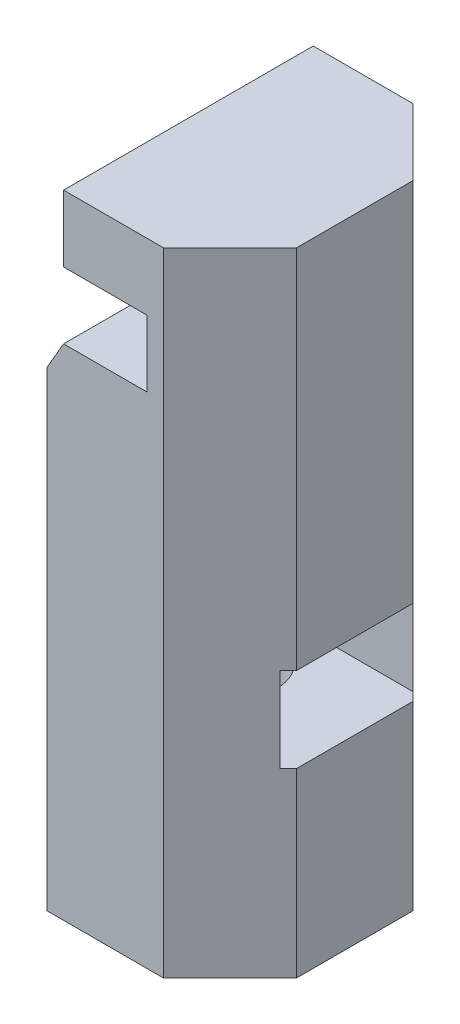
ISO-10303-21;
HEADER;
FILE_DESCRIPTION(('STEP AP214'),'2;1');
FILE_NAME('part.step','',(''),(''),'','','');
FILE_SCHEMA(('AUTOMOTIVE_DESIGN { 1 0 10303 214 1 1 1 1 }'));
ENDSEC;
DATA;
#1=APPLICATION_CONTEXT('core data for automotive mechanical design processes');
#2=APPLICATION_PROTOCOL_DEFINITION('international standard','automotive_design',2000,#1);
#3=PRODUCT_CONTEXT('',#1,'mechanical');
#4=PRODUCT('Part','Part','',(#3));
#5=PRODUCT_RELATED_PRODUCT_CATEGORY('part','',(#4));
#6=PRODUCT_DEFINITION_FORMATION('','',#4);
#7=PRODUCT_DEFINITION_CONTEXT('part definition',#1,'design');
#8=PRODUCT_DEFINITION('design','',#6,#7);
#9=PRODUCT_DEFINITION_SHAPE('','',#8);
#10=(LENGTH_UNIT() NAMED_UNIT(*) SI_UNIT(.MILLI.,.METRE.));
#11=(NAMED_UNIT(*) PLANE_ANGLE_UNIT() SI_UNIT($,.RADIAN.));
#12=(NAMED_UNIT(*) SI_UNIT($,.STERADIAN.) SOLID_ANGLE_UNIT());
#13=UNCERTAINTY_MEASURE_WITH_UNIT(LENGTH_MEASURE(1.E-05),#10,'distance_accuracy_value','');
#14=(GEOMETRIC_REPRESENTATION_CONTEXT(3) GLOBAL_UNCERTAINTY_ASSIGNED_CONTEXT((#13)) GLOBAL_UNIT_ASSIGNED_CONTEXT((#10,
#11,#12)) REPRESENTATION_CONTEXT('',''));
#15=CARTESIAN_POINT('',(0.,0.,0.));
#16=DIRECTION('',(0.,0.,1.));
#17=DIRECTION('',(1.,0.,0.));
#18=AXIS2_PLACEMENT_3D('',#15,#16,#17);
#19=CARTESIAN_POINT('',(3.99999999999999,8.,7.5));
#20=DIRECTION('',(-1.,0.,0.));
#21=DIRECTION('',(0.,-1.,0.));
#22=AXIS2_PLACEMENT_3D('',#19,#20,#21);
#23=PLANE('',#22);
#24=DIRECTION('',(0.,0.,-1.));
#25=VECTOR('',#24,1.);
#26=CARTESIAN_POINT('',(4.,-30.,7.5));
#27=LINE('',#26,#25);
#28=CARTESIAN_POINT('',(4.,-30.,3.49999999999999));
#29=VERTEX_POINT('',#28);
#30=CARTESIAN_POINT('',(4.,-30.,-3.49999999999999));
#31=VERTEX_POINT('',#30);
#32=EDGE_CURVE('E289',#29,#31,#27,.T.);
#33=ORIENTED_EDGE('',*,*,#32,.T.);
#34=DIRECTION('',(0.,1.,0.));
#35=VECTOR('',#34,1.);
#36=CARTESIAN_POINT('',(3.99999999999999,8.,-3.5));
#37=LINE('',#36,#35);
#38=CARTESIAN_POINT('',(4.,-19.1,-3.5));
#39=VERTEX_POINT('',#38);
#40=EDGE_CURVE('E279',#31,#39,#37,.T.);
#41=ORIENTED_EDGE('',*,*,#40,.T.);
#42=DIRECTION('',(0.,0.,-1.));
#43=VECTOR('',#42,1.);
#44=CARTESIAN_POINT('',(4.,-19.1,4.));
#45=LINE('',#44,#43);
#46=CARTESIAN_POINT('',(4.,-19.1,3.49999999999999));
#47=VERTEX_POINT('',#46);
#48=EDGE_CURVE('E286',#47,#39,#45,.T.);
#49=ORIENTED_EDGE('',*,*,#48,.F.);
#50=DIRECTION('',(0.,-1.,0.));
#51=VECTOR('',#50,1.);
#52=CARTESIAN_POINT('',(3.99999999999999,8.,3.49999999999999));
#53=LINE('',#52,#51);
#54=EDGE_CURVE('E274',#47,#29,#53,.T.);
#55=ORIENTED_EDGE('',*,*,#54,.T.);
#56=EDGE_LOOP('',(#33,#41,#49,#55));
#57=FACE_BOUND('',#56,.T.);
#58=ADVANCED_FACE('F33',(#57),#23,.F.);
#59=CARTESIAN_POINT('',(-11.,-30.,7.5));
#60=DIRECTION('',(1.,0.,0.));
#61=DIRECTION('',(0.,1.,0.));
#62=AXIS2_PLACEMENT_3D('',#59,#60,#61);
#63=PLANE('',#62);
#64=DIRECTION('',(0.,0.,-1.));
#65=VECTOR('',#64,1.);
#66=CARTESIAN_POINT('',(-11.,-30.,7.5));
#67=LINE('',#66,#65);
#68=CARTESIAN_POINT('',(-11.,-30.,3.49999999999999));
#69=VERTEX_POINT('',#68);
#70=CARTESIAN_POINT('',(-11.,-30.,-3.49999999999999));
#71=VERTEX_POINT('',#70);
#72=EDGE_CURVE('E357',#69,#71,#67,.T.);
#73=ORIENTED_EDGE('',*,*,#72,.F.);
#74=DIRECTION('',(0.,1.,0.));
#75=VECTOR('',#74,1.);
#76=CARTESIAN_POINT('',(-11.,-30.,3.49999999999999));
#77=LINE('',#76,#75);
#78=CARTESIAN_POINT('',(-11.,-19.1,3.49999999999999));
#79=VERTEX_POINT('',#78);
#80=EDGE_CURVE('E240',#69,#79,#77,.T.);
#81=ORIENTED_EDGE('',*,*,#80,.T.);
#82=DIRECTION('',(0.,0.,1.));
#83=VECTOR('',#82,1.);
#84=CARTESIAN_POINT('',(-11.,-19.1,4.));
#85=LINE('',#84,#83);
#86=CARTESIAN_POINT('',(-11.,-19.1,-3.5));
#87=VERTEX_POINT('',#86);
#88=EDGE_CURVE('E322',#87,#79,#85,.T.);
#89=ORIENTED_EDGE('',*,*,#88,.F.);
#90=DIRECTION('',(0.,-1.,0.));
#91=VECTOR('',#90,1.);
#92=CARTESIAN_POINT('',(-11.,-30.,-3.5));
#93=LINE('',#92,#91);
#94=EDGE_CURVE('E233',#87,#71,#93,.T.);
#95=ORIENTED_EDGE('',*,*,#94,.T.);
#96=EDGE_LOOP('',(#73,#81,#89,#95));
#97=FACE_BOUND('',#96,.T.);
#98=ADVANCED_FACE('F405',(#97),#63,.F.);
#99=CARTESIAN_POINT('',(-6.,4.,7.5));
#100=DIRECTION('',(1.,0.,0.));
#101=DIRECTION('',(0.,1.,0.));
#102=AXIS2_PLACEMENT_3D('',#99,#100,#101);
#103=PLANE('',#102);
#104=DIRECTION('',(0.,-1.,0.));
#105=VECTOR('',#104,1.);
#106=CARTESIAN_POINT('',(-6.,4.,-7.5));
#107=LINE('',#106,#105);
#108=CARTESIAN_POINT('',(-6.00000000000001,8.,-7.5));
#109=VERTEX_POINT('',#108);
#110=CARTESIAN_POINT('',(-6.,4.,-7.5));
#111=VERTEX_POINT('',#110);
#112=EDGE_CURVE('E200',#109,#111,#107,.T.);
#113=ORIENTED_EDGE('',*,*,#112,.T.);
#114=DIRECTION('',(0.,0.,-1.));
#115=VECTOR('',#114,1.);
#116=CARTESIAN_POINT('',(-6.,4.,7.5));
#117=LINE('',#116,#115);
#118=CARTESIAN_POINT('',(-6.,4.,7.5));
#119=VERTEX_POINT('',#118);
#120=EDGE_CURVE('E179',#119,#111,#117,.T.);
#121=ORIENTED_EDGE('',*,*,#120,.F.);
#122=DIRECTION('',(0.,-1.,0.));
#123=VECTOR('',#122,1.);
#124=CARTESIAN_POINT('',(-6.,4.,7.5));
#125=LINE('',#124,#123);
#126=CARTESIAN_POINT('',(-6.00000000000001,8.,7.5));
#127=VERTEX_POINT('',#126);
#128=EDGE_CURVE('E186',#127,#119,#125,.T.);
#129=ORIENTED_EDGE('',*,*,#128,.F.);
#130=DIRECTION('',(0.,0.,-1.));
#131=VECTOR('',#130,1.);
#132=CARTESIAN_POINT('',(-6.00000000000001,8.,7.5));
#133=LINE('',#132,#131);
#134=EDGE_CURVE('E340',#127,#109,#133,.T.);
#135=ORIENTED_EDGE('',*,*,#134,.T.);
#136=EDGE_LOOP('',(#113,#121,#129,#135));
#137=FACE_BOUND('',#136,.T.);
#138=ADVANCED_FACE('F198',(#137),#103,.F.);
#139=CARTESIAN_POINT('',(-1.,4.,7.5));
#140=DIRECTION('',(0.,1.,0.));
#141=DIRECTION('',(-1.,0.,0.));
#142=AXIS2_PLACEMENT_3D('',#139,#140,#141);
#143=PLANE('',#142);
#144=DIRECTION('',(1.,0.,0.));
#145=VECTOR('',#144,1.);
#146=CARTESIAN_POINT('',(-1.,4.,-7.5));
#147=LINE('',#146,#145);
#148=CARTESIAN_POINT('',(-1.,4.,-7.5));
#149=VERTEX_POINT('',#148);
#150=EDGE_CURVE('E342',#111,#149,#147,.T.);
#151=ORIENTED_EDGE('',*,*,#150,.T.);
#152=DIRECTION('',(0.,0.,-1.));
#153=VECTOR('',#152,1.);
#154=CARTESIAN_POINT('',(-1.,4.,7.5));
#155=LINE('',#154,#153);
#156=CARTESIAN_POINT('',(-1.,4.,7.5));
#157=VERTEX_POINT('',#156);
#158=EDGE_CURVE('E182',#157,#149,#155,.T.);
#159=ORIENTED_EDGE('',*,*,#158,.F.);
#160=DIRECTION('',(1.,0.,0.));
#161=VECTOR('',#160,1.);
#162=CARTESIAN_POINT('',(-1.,4.,7.5));
#163=LINE('',#162,#161);
#164=EDGE_CURVE('E175',#119,#157,#163,.T.);
#165=ORIENTED_EDGE('',*,*,#164,.F.);
#166=ORIENTED_EDGE('',*,*,#120,.T.);
#167=EDGE_LOOP('',(#151,#159,#165,#166));
#168=FACE_BOUND('',#167,.T.);
#169=ADVANCED_FACE('F177',(#168),#143,.F.);
#170=CARTESIAN_POINT('',(-1.,0.,7.5));
#171=DIRECTION('',(1.,0.,0.));
#172=DIRECTION('',(0.,1.,0.));
#173=AXIS2_PLACEMENT_3D('',#170,#171,#172);
#174=PLANE('',#173);
#175=DIRECTION('',(0.,-1.,0.));
#176=VECTOR('',#175,1.);
#177=CARTESIAN_POINT('',(-1.,0.,-7.5));
#178=LINE('',#177,#176);
#179=CARTESIAN_POINT('',(-1.,0.,-7.5));
#180=VERTEX_POINT('',#179);
#181=EDGE_CURVE('E344',#149,#180,#178,.T.);
#182=ORIENTED_EDGE('',*,*,#181,.T.);
#183=DIRECTION('',(0.,0.,-1.));
#184=VECTOR('',#183,1.);
#185=CARTESIAN_POINT('',(-1.,0.,7.5));
#186=LINE('',#185,#184);
#187=CARTESIAN_POINT('',(-1.,0.,7.5));
#188=VERTEX_POINT('',#187);
#189=EDGE_CURVE('E206',#188,#180,#186,.T.);
#190=ORIENTED_EDGE('',*,*,#189,.F.);
#191=DIRECTION('',(0.,-1.,0.));
#192=VECTOR('',#191,1.);
#193=CARTESIAN_POINT('',(-1.,0.,7.5));
#194=LINE('',#193,#192);
#195=EDGE_CURVE('E185',#157,#188,#194,.T.);
#196=ORIENTED_EDGE('',*,*,#195,.F.);
#197=ORIENTED_EDGE('',*,*,#158,.T.);
#198=EDGE_LOOP('',(#182,#190,#196,#197));
#199=FACE_BOUND('',#198,.T.);
#200=ADVANCED_FACE('F419',(#199),#174,.F.);
#201=CARTESIAN_POINT('',(-11.,0.,7.5));
#202=DIRECTION('',(0.,-1.,0.));
#203=DIRECTION('',(1.,0.,0.));
#204=AXIS2_PLACEMENT_3D('',#201,#202,#203);
#205=PLANE('',#204);
#206=DIRECTION('',(-1.,0.,0.));
#207=VECTOR('',#206,1.);
#208=CARTESIAN_POINT('',(-11.,0.,-7.5));
#209=LINE('',#208,#207);
#210=CARTESIAN_POINT('',(-5.99999999999999,0.,-7.5));
#211=VERTEX_POINT('',#210);
#212=EDGE_CURVE('E346',#180,#211,#209,.T.);
#213=ORIENTED_EDGE('',*,*,#212,.T.);
#214=DIRECTION('',(0.,0.,1.));
#215=VECTOR('',#214,1.);
#216=CARTESIAN_POINT('',(-5.99999999999999,0.,7.5));
#217=LINE('',#216,#215);
#218=CARTESIAN_POINT('',(-5.99999999999999,0.,7.5));
#219=VERTEX_POINT('',#218);
#220=EDGE_CURVE('E216',#211,#219,#217,.T.);
#221=ORIENTED_EDGE('',*,*,#220,.T.);
#222=DIRECTION('',(-1.,0.,0.));
#223=VECTOR('',#222,1.);
#224=CARTESIAN_POINT('',(-11.,0.,7.5));
#225=LINE('',#224,#223);
#226=EDGE_CURVE('E333',#188,#219,#225,.T.);
#227=ORIENTED_EDGE('',*,*,#226,.F.);
#228=ORIENTED_EDGE('',*,*,#189,.T.);
#229=EDGE_LOOP('',(#213,#221,#227,#228));
#230=FACE_BOUND('',#229,.T.);
#231=ADVANCED_FACE('F364',(#230),#205,.F.);
#232=DIRECTION('',(0.,0.,-1.));
#233=VECTOR('',#232,1.);
#234=CARTESIAN_POINT('',(-11.,-14.,4.));
#235=LINE('',#234,#233);
#236=CARTESIAN_POINT('',(-11.,-14.,3.49999999999999));
#237=VERTEX_POINT('',#236);
#238=CARTESIAN_POINT('',(-11.,-14.,-3.49999999999999));
#239=VERTEX_POINT('',#238);
#240=EDGE_CURVE('E301',#237,#239,#235,.T.);
#241=ORIENTED_EDGE('',*,*,#240,.F.);
#242=DIRECTION('',(0.,1.,0.));
#243=VECTOR('',#242,1.);
#244=CARTESIAN_POINT('',(-11.,-30.,3.49999999999999));
#245=LINE('',#244,#243);
#246=CARTESIAN_POINT('',(-11.,-8.66025403784437,3.49999999999999));
#247=VERTEX_POINT('',#246);
#248=EDGE_CURVE('E238',#237,#247,#245,.T.);
#249=ORIENTED_EDGE('',*,*,#248,.T.);
#250=DIRECTION('',(0.,0.,-1.));
#251=VECTOR('',#250,1.);
#252=CARTESIAN_POINT('',(-11.,-8.66025403784437,7.5));
#253=LINE('',#252,#251);
#254=CARTESIAN_POINT('',(-11.,-8.66025403784437,-3.49999999999999));
#255=VERTEX_POINT('',#254);
#256=EDGE_CURVE('E201',#247,#255,#253,.T.);
#257=ORIENTED_EDGE('',*,*,#256,.T.);
#258=DIRECTION('',(0.,-1.,0.));
#259=VECTOR('',#258,1.);
#260=CARTESIAN_POINT('',(-11.,-30.,-3.5));
#261=LINE('',#260,#259);
#262=EDGE_CURVE('E235',#255,#239,#261,.T.);
#263=ORIENTED_EDGE('',*,*,#262,.T.);
#264=EDGE_LOOP('',(#241,#249,#257,#263));
#265=FACE_BOUND('',#264,.T.);
#266=ADVANCED_FACE('F385',(#265),#63,.F.);
#267=CARTESIAN_POINT('',(4.,-30.,7.5));
#268=DIRECTION('',(0.,1.,0.));
#269=DIRECTION('',(-1.,0.,0.));
#270=AXIS2_PLACEMENT_3D('',#267,#268,#269);
#271=PLANE('',#270);
#272=CARTESIAN_POINT('',(-3.5,-30.,0.));
#273=DIRECTION('',(0.,-1.,0.));
#274=DIRECTION('',(1.,0.,0.));
#275=AXIS2_PLACEMENT_3D('',#272,#273,#274);
#276=CIRCLE('',#275,5.25);
#277=CARTESIAN_POINT('',(1.75,-30.,0.));
#278=VERTEX_POINT('',#277);
#279=EDGE_CURVE('E212',#278,#278,#276,.T.);
#280=ORIENTED_EDGE('',*,*,#279,.F.);
#281=EDGE_LOOP('',(#280));
#282=FACE_BOUND('',#281,.T.);
#283=DIRECTION('',(1.,0.,0.));
#284=VECTOR('',#283,1.);
#285=CARTESIAN_POINT('',(4.,-30.,7.5));
#286=LINE('',#285,#284);
#287=CARTESIAN_POINT('',(-6.99999999999999,-30.,7.5));
#288=VERTEX_POINT('',#287);
#289=CARTESIAN_POINT('',(0.,-30.,7.5));
#290=VERTEX_POINT('',#289);
#291=EDGE_CURVE('E336',#288,#290,#286,.T.);
#292=ORIENTED_EDGE('',*,*,#291,.F.);
#293=DIRECTION('',(0.707106781186547,0.,0.707106781186548));
#294=VECTOR('',#293,1.);
#295=CARTESIAN_POINT('',(-6.99999999999999,-30.,7.5));
#296=LINE('',#295,#294);
#297=EDGE_CURVE('E231',#288,#69,#296,.F.);
#298=ORIENTED_EDGE('',*,*,#297,.T.);
#299=ORIENTED_EDGE('',*,*,#72,.T.);
#300=DIRECTION('',(0.707106781186549,0.,-0.707106781186546));
#301=VECTOR('',#300,1.);
#302=CARTESIAN_POINT('',(-11.,-30.,-3.5));
#303=LINE('',#302,#301);
#304=CARTESIAN_POINT('',(-6.99999999999998,-30.,-7.5));
#305=VERTEX_POINT('',#304);
#306=EDGE_CURVE('E229',#71,#305,#303,.T.);
#307=ORIENTED_EDGE('',*,*,#306,.T.);
#308=DIRECTION('',(1.,0.,0.));
#309=VECTOR('',#308,1.);
#310=CARTESIAN_POINT('',(4.,-30.,-7.5));
#311=LINE('',#310,#309);
#312=CARTESIAN_POINT('',(0.,-30.,-7.5));
#313=VERTEX_POINT('',#312);
#314=EDGE_CURVE('E349',#305,#313,#311,.T.);
#315=ORIENTED_EDGE('',*,*,#314,.T.);
#316=DIRECTION('',(0.707106781186549,0.,0.707106781186546));
#317=VECTOR('',#316,1.);
#318=CARTESIAN_POINT('',(4.,-30.,-3.49999999999999));
#319=LINE('',#318,#317);
#320=EDGE_CURVE('E227',#313,#31,#319,.T.);
#321=ORIENTED_EDGE('',*,*,#320,.T.);
#322=ORIENTED_EDGE('',*,*,#32,.F.);
#323=DIRECTION('',(0.707106781186547,0.,-0.707106781186548));
#324=VECTOR('',#323,1.);
#325=CARTESIAN_POINT('',(0.,-30.,7.5));
#326=LINE('',#325,#324);
#327=EDGE_CURVE('E225',#29,#290,#326,.F.);
#328=ORIENTED_EDGE('',*,*,#327,.T.);
#329=EDGE_LOOP('',(#292,#298,#299,#307,#315,#321,#322,#328));
#330=FACE_BOUND('',#329,.T.);
#331=ADVANCED_FACE('F403',(#282,#330),#271,.F.);
#332=DIRECTION('',(0.,0.,1.));
#333=VECTOR('',#332,1.);
#334=CARTESIAN_POINT('',(4.,-14.,4.));
#335=LINE('',#334,#333);
#336=CARTESIAN_POINT('',(4.,-14.,-3.5));
#337=VERTEX_POINT('',#336);
#338=CARTESIAN_POINT('',(4.,-14.,3.49999999999999));
#339=VERTEX_POINT('',#338);
#340=EDGE_CURVE('E300',#337,#339,#335,.T.);
#341=ORIENTED_EDGE('',*,*,#340,.F.);
#342=DIRECTION('',(0.,1.,0.));
#343=VECTOR('',#342,1.);
#344=CARTESIAN_POINT('',(3.99999999999999,8.,-3.5));
#345=LINE('',#344,#343);
#346=CARTESIAN_POINT('',(4.,8.,-3.49999999999999));
#347=VERTEX_POINT('',#346);
#348=EDGE_CURVE('E48',#337,#347,#345,.T.);
#349=ORIENTED_EDGE('',*,*,#348,.T.);
#350=DIRECTION('',(0.,0.,-1.));
#351=VECTOR('',#350,1.);
#352=CARTESIAN_POINT('',(3.99999999999999,8.,7.5));
#353=LINE('',#352,#351);
#354=CARTESIAN_POINT('',(3.99999999999999,8.,3.49999999999999));
#355=VERTEX_POINT('',#354);
#356=EDGE_CURVE('E354',#355,#347,#353,.T.);
#357=ORIENTED_EDGE('',*,*,#356,.F.);
#358=DIRECTION('',(0.,-1.,0.));
#359=VECTOR('',#358,1.);
#360=CARTESIAN_POINT('',(3.99999999999999,8.,3.49999999999999));
#361=LINE('',#360,#359);
#362=EDGE_CURVE('E276',#355,#339,#361,.T.);
#363=ORIENTED_EDGE('',*,*,#362,.T.);
#364=EDGE_LOOP('',(#341,#349,#357,#363));
#365=FACE_BOUND('',#364,.T.);
#366=ADVANCED_FACE('F430',(#365),#23,.F.);
#367=CARTESIAN_POINT('',(-6.00000000000001,8.,7.5));
#368=DIRECTION('',(0.,-1.,0.));
#369=DIRECTION('',(0.,0.,-1.));
#370=AXIS2_PLACEMENT_3D('',#367,#368,#369);
#371=PLANE('',#370);
#372=ORIENTED_EDGE('',*,*,#356,.T.);
#373=DIRECTION('',(-0.707106781186549,0.,-0.707106781186546));
#374=VECTOR('',#373,1.);
#375=CARTESIAN_POINT('',(3.99999999999999,8.,-3.5));
#376=LINE('',#375,#374);
#377=CARTESIAN_POINT('',(0.,8.,-7.5));
#378=VERTEX_POINT('',#377);
#379=EDGE_CURVE('E11',#347,#378,#376,.T.);
#380=ORIENTED_EDGE('',*,*,#379,.T.);
#381=DIRECTION('',(-1.,0.,0.));
#382=VECTOR('',#381,1.);
#383=CARTESIAN_POINT('',(-6.00000000000001,8.,-7.5));
#384=LINE('',#383,#382);
#385=EDGE_CURVE('E196',#378,#109,#384,.T.);
#386=ORIENTED_EDGE('',*,*,#385,.T.);
#387=ORIENTED_EDGE('',*,*,#134,.F.);
#388=DIRECTION('',(-1.,0.,0.));
#389=VECTOR('',#388,1.);
#390=CARTESIAN_POINT('',(-6.00000000000001,8.,7.5));
#391=LINE('',#390,#389);
#392=CARTESIAN_POINT('',(0.,8.,7.5));
#393=VERTEX_POINT('',#392);
#394=EDGE_CURVE('E192',#393,#127,#391,.T.);
#395=ORIENTED_EDGE('',*,*,#394,.F.);
#396=DIRECTION('',(-0.707106781186547,0.,0.707106781186548));
#397=VECTOR('',#396,1.);
#398=CARTESIAN_POINT('',(0.,8.,7.5));
#399=LINE('',#398,#397);
#400=EDGE_CURVE('E41',#393,#355,#399,.F.);
#401=ORIENTED_EDGE('',*,*,#400,.T.);
#402=EDGE_LOOP('',(#372,#380,#386,#387,#395,#401));
#403=FACE_BOUND('',#402,.T.);
#404=ADVANCED_FACE('F418',(#403),#371,.F.);
#405=CARTESIAN_POINT('',(0.,0.,7.5));
#406=DIRECTION('',(0.,0.,-1.));
#407=DIRECTION('',(-1.,0.,0.));
#408=AXIS2_PLACEMENT_3D('',#405,#406,#407);
#409=PLANE('',#408);
#410=DIRECTION('',(0.500000000000001,0.866025403784438,0.));
#411=VECTOR('',#410,1.);
#412=CARTESIAN_POINT('',(-11.,-8.66025403784437,7.5));
#413=LINE('',#412,#411);
#414=CARTESIAN_POINT('',(-6.99999999999999,-1.73205080756888,7.5));
#415=VERTEX_POINT('',#414);
#416=EDGE_CURVE('E218',#219,#415,#413,.F.);
#417=ORIENTED_EDGE('',*,*,#416,.T.);
#418=DIRECTION('',(0.,-1.,0.));
#419=VECTOR('',#418,1.);
#420=CARTESIAN_POINT('',(-6.99999999999999,0.,7.5));
#421=LINE('',#420,#419);
#422=EDGE_CURVE('E222',#415,#288,#421,.T.);
#423=ORIENTED_EDGE('',*,*,#422,.T.);
#424=ORIENTED_EDGE('',*,*,#291,.T.);
#425=DIRECTION('',(0.,1.,0.));
#426=VECTOR('',#425,1.);
#427=CARTESIAN_POINT('',(0.,0.,7.5));
#428=LINE('',#427,#426);
#429=EDGE_CURVE('E220',#290,#393,#428,.T.);
#430=ORIENTED_EDGE('',*,*,#429,.T.);
#431=ORIENTED_EDGE('',*,*,#394,.T.);
#432=ORIENTED_EDGE('',*,*,#128,.T.);
#433=ORIENTED_EDGE('',*,*,#164,.T.);
#434=ORIENTED_EDGE('',*,*,#195,.T.);
#435=ORIENTED_EDGE('',*,*,#226,.T.);
#436=EDGE_LOOP('',(#417,#423,#424,#430,#431,#432,#433,#434,#435));
#437=FACE_BOUND('',#436,.T.);
#438=ADVANCED_FACE('F190',(#437),#409,.F.);
#439=CARTESIAN_POINT('',(0.,0.,-7.5));
#440=DIRECTION('',(0.,0.,-1.));
#441=DIRECTION('',(-1.,0.,0.));
#442=AXIS2_PLACEMENT_3D('',#439,#440,#441);
#443=PLANE('',#442);
#444=ORIENTED_EDGE('',*,*,#314,.F.);
#445=DIRECTION('',(0.,1.,0.));
#446=VECTOR('',#445,1.);
#447=CARTESIAN_POINT('',(-6.99999999999998,-8.66025403784435,-7.5));
#448=LINE('',#447,#446);
#449=CARTESIAN_POINT('',(-6.99999999999998,-1.73205080756886,-7.5));
#450=VERTEX_POINT('',#449);
#451=EDGE_CURVE('E272',#305,#450,#448,.T.);
#452=ORIENTED_EDGE('',*,*,#451,.T.);
#453=DIRECTION('',(-0.500000000000001,-0.866025403784438,0.));
#454=VECTOR('',#453,1.);
#455=CARTESIAN_POINT('',(-4.49999999999998,2.59807621135332,-7.5));
#456=LINE('',#455,#454);
#457=EDGE_CURVE('E204',#450,#211,#456,.F.);
#458=ORIENTED_EDGE('',*,*,#457,.T.);
#459=ORIENTED_EDGE('',*,*,#212,.F.);
#460=ORIENTED_EDGE('',*,*,#181,.F.);
#461=ORIENTED_EDGE('',*,*,#150,.F.);
#462=ORIENTED_EDGE('',*,*,#112,.F.);
#463=ORIENTED_EDGE('',*,*,#385,.F.);
#464=DIRECTION('',(0.,-1.,0.));
#465=VECTOR('',#464,1.);
#466=CARTESIAN_POINT('',(0.,-30.,-7.5));
#467=LINE('',#466,#465);
#468=EDGE_CURVE('E270',#378,#313,#467,.T.);
#469=ORIENTED_EDGE('',*,*,#468,.T.);
#470=EDGE_LOOP('',(#444,#452,#458,#459,#460,#461,#462,#463,#469));
#471=FACE_BOUND('',#470,.T.);
#472=ADVANCED_FACE('F370',(#471),#443,.T.);
#473=CARTESIAN_POINT('',(-3.5,-24.,0.));
#474=DIRECTION('',(0.,-1.,0.));
#475=DIRECTION('',(1.,0.,0.));
#476=AXIS2_PLACEMENT_3D('',#473,#474,#475);
#477=CYLINDRICAL_SURFACE('',#476,5.25);
#478=CARTESIAN_POINT('',(-3.5,-24.,0.));
#479=DIRECTION('',(0.,-1.,0.));
#480=DIRECTION('',(1.,0.,0.));
#481=AXIS2_PLACEMENT_3D('',#478,#479,#480);
#482=CIRCLE('',#481,5.25);
#483=CARTESIAN_POINT('',(1.75,-24.,0.));
#484=VERTEX_POINT('',#483);
#485=EDGE_CURVE('E327',#484,#484,#482,.T.);
#486=ORIENTED_EDGE('',*,*,#485,.F.);
#487=EDGE_LOOP('',(#486));
#488=FACE_BOUND('',#487,.T.);
#489=ORIENTED_EDGE('',*,*,#279,.T.);
#490=EDGE_LOOP('',(#489));
#491=FACE_BOUND('',#490,.T.);
#492=ADVANCED_FACE('F471',(#488,#491),#477,.F.);
#493=CARTESIAN_POINT('',(-3.5,-24.,0.));
#494=DIRECTION('',(0.,-1.,0.));
#495=DIRECTION('',(1.,0.,0.));
#496=AXIS2_PLACEMENT_3D('',#493,#494,#495);
#497=PLANE('',#496);
#498=CARTESIAN_POINT('',(-3.5,-24.,0.));
#499=DIRECTION('',(0.,-1.,0.));
#500=DIRECTION('',(1.,0.,0.));
#501=AXIS2_PLACEMENT_3D('',#498,#499,#500);
#502=CIRCLE('',#501,2.75);
#503=CARTESIAN_POINT('',(-0.749999999999998,-24.,0.));
#504=VERTEX_POINT('',#503);
#505=EDGE_CURVE('E210',#504,#504,#502,.T.);
#506=ORIENTED_EDGE('',*,*,#505,.F.);
#507=EDGE_LOOP('',(#506));
#508=FACE_BOUND('',#507,.T.);
#509=ORIENTED_EDGE('',*,*,#485,.T.);
#510=EDGE_LOOP('',(#509));
#511=FACE_BOUND('',#510,.T.);
#512=ADVANCED_FACE('F459',(#508,#511),#497,.T.);
#513=CARTESIAN_POINT('',(-3.5,-1.99999999999999,0.));
#514=DIRECTION('',(0.,-1.,0.));
#515=DIRECTION('',(1.,0.,0.));
#516=AXIS2_PLACEMENT_3D('',#513,#514,#515);
#517=CYLINDRICAL_SURFACE('',#516,2.75);
#518=CARTESIAN_POINT('',(-3.5,-19.1,0.));
#519=DIRECTION('',(0.,-1.,0.));
#520=DIRECTION('',(0.,0.,-1.));
#521=AXIS2_PLACEMENT_3D('',#518,#519,#520);
#522=CIRCLE('',#521,2.75);
#523=CARTESIAN_POINT('',(-3.5,-19.1,-2.75));
#524=VERTEX_POINT('',#523);
#525=EDGE_CURVE('E313',#524,#524,#522,.T.);
#526=ORIENTED_EDGE('',*,*,#525,.F.);
#527=EDGE_LOOP('',(#526));
#528=FACE_BOUND('',#527,.T.);
#529=ORIENTED_EDGE('',*,*,#505,.T.);
#530=EDGE_LOOP('',(#529));
#531=FACE_BOUND('',#530,.T.);
#532=ADVANCED_FACE('F452',(#528,#531),#517,.F.);
#533=CARTESIAN_POINT('',(-11.001,-14.,4.));
#534=DIRECTION('',(0.,0.,1.));
#535=DIRECTION('',(0.,-1.,0.));
#536=AXIS2_PLACEMENT_3D('',#533,#534,#535);
#537=PLANE('',#536);
#538=DIRECTION('',(1.,0.,0.));
#539=VECTOR('',#538,1.);
#540=CARTESIAN_POINT('',(-11.001,-19.1,4.));
#541=LINE('',#540,#539);
#542=CARTESIAN_POINT('',(-10.5,-19.1,4.));
#543=VERTEX_POINT('',#542);
#544=CARTESIAN_POINT('',(3.49999999999999,-19.1,4.));
#545=VERTEX_POINT('',#544);
#546=EDGE_CURVE('E304',#543,#545,#541,.T.);
#547=ORIENTED_EDGE('',*,*,#546,.F.);
#548=DIRECTION('',(0.,-1.,0.));
#549=VECTOR('',#548,1.);
#550=CARTESIAN_POINT('',(-10.5,0.,4.));
#551=LINE('',#550,#549);
#552=CARTESIAN_POINT('',(-10.5,-14.,4.));
#553=VERTEX_POINT('',#552);
#554=EDGE_CURVE('E252',#543,#553,#551,.F.);
#555=ORIENTED_EDGE('',*,*,#554,.T.);
#556=DIRECTION('',(1.,0.,0.));
#557=VECTOR('',#556,1.);
#558=CARTESIAN_POINT('',(-11.001,-14.,4.));
#559=LINE('',#558,#557);
#560=CARTESIAN_POINT('',(3.49999999999999,-14.,4.));
#561=VERTEX_POINT('',#560);
#562=EDGE_CURVE('E310',#553,#561,#559,.T.);
#563=ORIENTED_EDGE('',*,*,#562,.T.);
#564=DIRECTION('',(0.,1.,0.));
#565=VECTOR('',#564,1.);
#566=CARTESIAN_POINT('',(3.49999999999998,0.,4.));
#567=LINE('',#566,#565);
#568=EDGE_CURVE('E250',#561,#545,#567,.F.);
#569=ORIENTED_EDGE('',*,*,#568,.T.);
#570=EDGE_LOOP('',(#547,#555,#563,#569));
#571=FACE_BOUND('',#570,.T.);
#572=ADVANCED_FACE('F449',(#571),#537,.F.);
#573=CARTESIAN_POINT('',(-11.001,-14.,-4.));
#574=DIRECTION('',(0.,0.,-1.));
#575=DIRECTION('',(0.,1.,0.));
#576=AXIS2_PLACEMENT_3D('',#573,#574,#575);
#577=PLANE('',#576);
#578=DIRECTION('',(1.,0.,0.));
#579=VECTOR('',#578,1.);
#580=CARTESIAN_POINT('',(-11.001,-14.,-4.));
#581=LINE('',#580,#579);
#582=CARTESIAN_POINT('',(-10.5,-14.,-4.));
#583=VERTEX_POINT('',#582);
#584=CARTESIAN_POINT('',(3.49999999999999,-14.,-4.));
#585=VERTEX_POINT('',#584);
#586=EDGE_CURVE('E314',#583,#585,#581,.T.);
#587=ORIENTED_EDGE('',*,*,#586,.F.);
#588=DIRECTION('',(0.,-1.,0.));
#589=VECTOR('',#588,1.);
#590=CARTESIAN_POINT('',(-10.5,-30.,-4.00000000000001));
#591=LINE('',#590,#589);
#592=CARTESIAN_POINT('',(-10.5,-19.1,-4.));
#593=VERTEX_POINT('',#592);
#594=EDGE_CURVE('E268',#583,#593,#591,.T.);
#595=ORIENTED_EDGE('',*,*,#594,.T.);
#596=DIRECTION('',(1.,0.,0.));
#597=VECTOR('',#596,1.);
#598=CARTESIAN_POINT('',(-11.001,-19.1,-4.));
#599=LINE('',#598,#597);
#600=CARTESIAN_POINT('',(3.49999999999999,-19.1,-4.));
#601=VERTEX_POINT('',#600);
#602=EDGE_CURVE('E317',#593,#601,#599,.T.);
#603=ORIENTED_EDGE('',*,*,#602,.T.);
#604=DIRECTION('',(0.,1.,0.));
#605=VECTOR('',#604,1.);
#606=CARTESIAN_POINT('',(3.5,8.,-3.99999999999999));
#607=LINE('',#606,#605);
#608=EDGE_CURVE('E266',#601,#585,#607,.T.);
#609=ORIENTED_EDGE('',*,*,#608,.T.);
#610=EDGE_LOOP('',(#587,#595,#603,#609));
#611=FACE_BOUND('',#610,.T.);
#612=ADVANCED_FACE('F446',(#611),#577,.F.);
#613=CARTESIAN_POINT('',(-11.001,-14.,4.));
#614=DIRECTION('',(0.,1.,0.));
#615=DIRECTION('',(0.,0.,1.));
#616=AXIS2_PLACEMENT_3D('',#613,#614,#615);
#617=PLANE('',#616);
#618=ORIENTED_EDGE('',*,*,#562,.F.);
#619=DIRECTION('',(0.707106781186547,0.,0.707106781186548));
#620=VECTOR('',#619,1.);
#621=CARTESIAN_POINT('',(-6.99999999999999,-14.,7.5));
#622=LINE('',#621,#620);
#623=EDGE_CURVE('E260',#553,#237,#622,.F.);
#624=ORIENTED_EDGE('',*,*,#623,.T.);
#625=ORIENTED_EDGE('',*,*,#240,.T.);
#626=DIRECTION('',(0.707106781186549,0.,-0.707106781186546));
#627=VECTOR('',#626,1.);
#628=CARTESIAN_POINT('',(-11.,-14.,-3.5));
#629=LINE('',#628,#627);
#630=EDGE_CURVE('E258',#239,#583,#629,.T.);
#631=ORIENTED_EDGE('',*,*,#630,.T.);
#632=ORIENTED_EDGE('',*,*,#586,.T.);
#633=DIRECTION('',(0.707106781186549,0.,0.707106781186546));
#634=VECTOR('',#633,1.);
#635=CARTESIAN_POINT('',(4.,-14.,-3.5));
#636=LINE('',#635,#634);
#637=EDGE_CURVE('E256',#585,#337,#636,.T.);
#638=ORIENTED_EDGE('',*,*,#637,.T.);
#639=ORIENTED_EDGE('',*,*,#340,.T.);
#640=DIRECTION('',(0.707106781186547,0.,-0.707106781186548));
#641=VECTOR('',#640,1.);
#642=CARTESIAN_POINT('',(0.,-14.,7.5));
#643=LINE('',#642,#641);
#644=EDGE_CURVE('E254',#339,#561,#643,.F.);
#645=ORIENTED_EDGE('',*,*,#644,.T.);
#646=EDGE_LOOP('',(#618,#624,#625,#631,#632,#638,#639,#645));
#647=FACE_BOUND('',#646,.T.);
#648=CARTESIAN_POINT('',(-3.5,-14.,0.));
#649=DIRECTION('',(0.,1.,0.));
#650=DIRECTION('',(0.,0.,1.));
#651=AXIS2_PLACEMENT_3D('',#648,#649,#650);
#652=CIRCLE('',#651,2.75);
#653=CARTESIAN_POINT('',(-3.5,-14.,2.75));
#654=VERTEX_POINT('',#653);
#655=EDGE_CURVE('E324',#654,#654,#652,.T.);
#656=ORIENTED_EDGE('',*,*,#655,.T.);
#657=EDGE_LOOP('',(#656));
#658=FACE_BOUND('',#657,.T.);
#659=ADVANCED_FACE('F389',(#647,#658),#617,.F.);
#660=CARTESIAN_POINT('',(-11.001,-19.1,4.));
#661=DIRECTION('',(0.,-1.,0.));
#662=DIRECTION('',(0.,0.,-1.));
#663=AXIS2_PLACEMENT_3D('',#660,#661,#662);
#664=PLANE('',#663);
#665=ORIENTED_EDGE('',*,*,#88,.T.);
#666=DIRECTION('',(-0.707106781186547,0.,-0.707106781186548));
#667=VECTOR('',#666,1.);
#668=CARTESIAN_POINT('',(-6.99999999999999,-19.1,7.5));
#669=LINE('',#668,#667);
#670=EDGE_CURVE('E248',#79,#543,#669,.F.);
#671=ORIENTED_EDGE('',*,*,#670,.T.);
#672=ORIENTED_EDGE('',*,*,#546,.T.);
#673=DIRECTION('',(-0.707106781186547,0.,0.707106781186548));
#674=VECTOR('',#673,1.);
#675=CARTESIAN_POINT('',(0.,-19.1,7.5));
#676=LINE('',#675,#674);
#677=EDGE_CURVE('E242',#545,#47,#676,.F.);
#678=ORIENTED_EDGE('',*,*,#677,.T.);
#679=ORIENTED_EDGE('',*,*,#48,.T.);
#680=DIRECTION('',(-0.707106781186549,0.,-0.707106781186546));
#681=VECTOR('',#680,1.);
#682=CARTESIAN_POINT('',(4.,-19.1,-3.5));
#683=LINE('',#682,#681);
#684=EDGE_CURVE('E244',#39,#601,#683,.T.);
#685=ORIENTED_EDGE('',*,*,#684,.T.);
#686=ORIENTED_EDGE('',*,*,#602,.F.);
#687=DIRECTION('',(-0.707106781186549,0.,0.707106781186546));
#688=VECTOR('',#687,1.);
#689=CARTESIAN_POINT('',(-11.,-19.1,-3.5));
#690=LINE('',#689,#688);
#691=EDGE_CURVE('E246',#593,#87,#690,.T.);
#692=ORIENTED_EDGE('',*,*,#691,.T.);
#693=EDGE_LOOP('',(#665,#671,#672,#678,#679,#685,#686,#692));
#694=FACE_BOUND('',#693,.T.);
#695=ORIENTED_EDGE('',*,*,#525,.T.);
#696=EDGE_LOOP('',(#695));
#697=FACE_BOUND('',#696,.T.);
#698=ADVANCED_FACE('F294',(#694,#697),#664,.F.);
#699=CARTESIAN_POINT('',(-3.5,-1.99999999999999,0.));
#700=DIRECTION('',(0.,-1.,0.));
#701=DIRECTION('',(1.,0.,0.));
#702=AXIS2_PLACEMENT_3D('',#699,#700,#701);
#703=PLANE('',#702);
#704=CARTESIAN_POINT('',(-3.5,-1.99999999999999,0.));
#705=DIRECTION('',(0.,-1.,0.));
#706=DIRECTION('',(1.,0.,0.));
#707=AXIS2_PLACEMENT_3D('',#704,#705,#706);
#708=CIRCLE('',#707,2.75);
#709=CARTESIAN_POINT('',(-0.750000000000003,-1.99999999999999,0.));
#710=VERTEX_POINT('',#709);
#711=EDGE_CURVE('E213',#710,#710,#708,.T.);
#712=ORIENTED_EDGE('',*,*,#711,.T.);
#713=EDGE_LOOP('',(#712));
#714=FACE_BOUND('',#713,.T.);
#715=ADVANCED_FACE('F465',(#714),#703,.T.);
#716=ORIENTED_EDGE('',*,*,#655,.F.);
#717=EDGE_LOOP('',(#716));
#718=FACE_BOUND('',#717,.T.);
#719=ORIENTED_EDGE('',*,*,#711,.F.);
#720=EDGE_LOOP('',(#719));
#721=FACE_BOUND('',#720,.T.);
#722=ADVANCED_FACE('F462',(#718,#721),#517,.F.);
#723=CARTESIAN_POINT('',(-11.,-8.66025403784437,7.5));
#724=DIRECTION('',(0.866025403784438,-0.500000000000001,0.));
#725=DIRECTION('',(0.,0.,-1.));
#726=AXIS2_PLACEMENT_3D('',#723,#724,#725);
#727=PLANE('',#726);
#728=ORIENTED_EDGE('',*,*,#256,.F.);
#729=DIRECTION('',(0.447213595499959,0.774596669241482,0.44721359549996));
#730=VECTOR('',#729,1.);
#731=CARTESIAN_POINT('',(-10.2,-7.27461339178926,4.3));
#732=LINE('',#731,#730);
#733=EDGE_CURVE('E264',#247,#415,#732,.T.);
#734=ORIENTED_EDGE('',*,*,#733,.T.);
#735=ORIENTED_EDGE('',*,*,#416,.F.);
#736=ORIENTED_EDGE('',*,*,#220,.F.);
#737=ORIENTED_EDGE('',*,*,#457,.F.);
#738=DIRECTION('',(0.447213595499959,0.774596669241483,-0.447213595499958));
#739=VECTOR('',#738,1.);
#740=CARTESIAN_POINT('',(-13.2,-12.4707658144959,-1.3));
#741=LINE('',#740,#739);
#742=EDGE_CURVE('E262',#450,#255,#741,.F.);
#743=ORIENTED_EDGE('',*,*,#742,.T.);
#744=EDGE_LOOP('',(#728,#734,#735,#736,#737,#743));
#745=FACE_BOUND('',#744,.T.);
#746=ADVANCED_FACE('F376',(#745),#727,.F.);
#747=CARTESIAN_POINT('',(-6.99999999999999,0.,7.5));
#748=DIRECTION('',(0.707106781186548,0.,-0.707106781186547));
#749=DIRECTION('',(0.,-1.,0.));
#750=AXIS2_PLACEMENT_3D('',#747,#748,#749);
#751=PLANE('',#750);
#752=ORIENTED_EDGE('',*,*,#670,.F.);
#753=ORIENTED_EDGE('',*,*,#80,.F.);
#754=ORIENTED_EDGE('',*,*,#297,.F.);
#755=ORIENTED_EDGE('',*,*,#422,.F.);
#756=ORIENTED_EDGE('',*,*,#733,.F.);
#757=ORIENTED_EDGE('',*,*,#248,.F.);
#758=ORIENTED_EDGE('',*,*,#623,.F.);
#759=ORIENTED_EDGE('',*,*,#554,.F.);
#760=EDGE_LOOP('',(#752,#753,#754,#755,#756,#757,#758,#759));
#761=FACE_BOUND('',#760,.T.);
#762=ADVANCED_FACE('F396',(#761),#751,.F.);
#763=CARTESIAN_POINT('',(-11.,-30.,-3.5));
#764=DIRECTION('',(-0.707106781186546,0.,-0.707106781186549));
#765=DIRECTION('',(0.,1.,0.));
#766=AXIS2_PLACEMENT_3D('',#763,#764,#765);
#767=PLANE('',#766);
#768=ORIENTED_EDGE('',*,*,#742,.F.);
#769=ORIENTED_EDGE('',*,*,#451,.F.);
#770=ORIENTED_EDGE('',*,*,#306,.F.);
#771=ORIENTED_EDGE('',*,*,#94,.F.);
#772=ORIENTED_EDGE('',*,*,#691,.F.);
#773=ORIENTED_EDGE('',*,*,#594,.F.);
#774=ORIENTED_EDGE('',*,*,#630,.F.);
#775=ORIENTED_EDGE('',*,*,#262,.F.);
#776=EDGE_LOOP('',(#768,#769,#770,#771,#772,#773,#774,#775));
#777=FACE_BOUND('',#776,.T.);
#778=ADVANCED_FACE('F380',(#777),#767,.T.);
#779=CARTESIAN_POINT('',(3.99999999999999,8.,-3.5));
#780=DIRECTION('',(0.707106781186546,0.,-0.707106781186549));
#781=DIRECTION('',(0.,-1.,0.));
#782=AXIS2_PLACEMENT_3D('',#779,#780,#781);
#783=PLANE('',#782);
#784=ORIENTED_EDGE('',*,*,#320,.F.);
#785=ORIENTED_EDGE('',*,*,#468,.F.);
#786=ORIENTED_EDGE('',*,*,#379,.F.);
#787=ORIENTED_EDGE('',*,*,#348,.F.);
#788=ORIENTED_EDGE('',*,*,#637,.F.);
#789=ORIENTED_EDGE('',*,*,#608,.F.);
#790=ORIENTED_EDGE('',*,*,#684,.F.);
#791=ORIENTED_EDGE('',*,*,#40,.F.);
#792=EDGE_LOOP('',(#784,#785,#786,#787,#788,#789,#790,#791));
#793=FACE_BOUND('',#792,.T.);
#794=ADVANCED_FACE('F412',(#793),#783,.T.);
#795=CARTESIAN_POINT('',(0.,0.,7.5));
#796=DIRECTION('',(-0.707106781186548,0.,-0.707106781186547));
#797=DIRECTION('',(0.,1.,0.));
#798=AXIS2_PLACEMENT_3D('',#795,#796,#797);
#799=PLANE('',#798);
#800=ORIENTED_EDGE('',*,*,#644,.F.);
#801=ORIENTED_EDGE('',*,*,#362,.F.);
#802=ORIENTED_EDGE('',*,*,#400,.F.);
#803=ORIENTED_EDGE('',*,*,#429,.F.);
#804=ORIENTED_EDGE('',*,*,#327,.F.);
#805=ORIENTED_EDGE('',*,*,#54,.F.);
#806=ORIENTED_EDGE('',*,*,#677,.F.);
#807=ORIENTED_EDGE('',*,*,#568,.F.);
#808=EDGE_LOOP('',(#800,#801,#802,#803,#804,#805,#806,#807));
#809=FACE_BOUND('',#808,.T.);
#810=ADVANCED_FACE('F35',(#809),#799,.F.);
#811=CLOSED_SHELL('',(#58,#98,#138,#169,#200,#231,#266,#331,#366,#404,#438,#472,#492,#512,#532,
#572,#612,#659,#698,#715,#722,#746,#762,#778,#794,#810));
#812=MANIFOLD_SOLID_BREP('B2',#811);
#813=ADVANCED_BREP_SHAPE_REPRESENTATION('',(#18,#812),#14);
#814=SHAPE_DEFINITION_REPRESENTATION(#9,#813);
ENDSEC;
END-ISO-10303-21;
